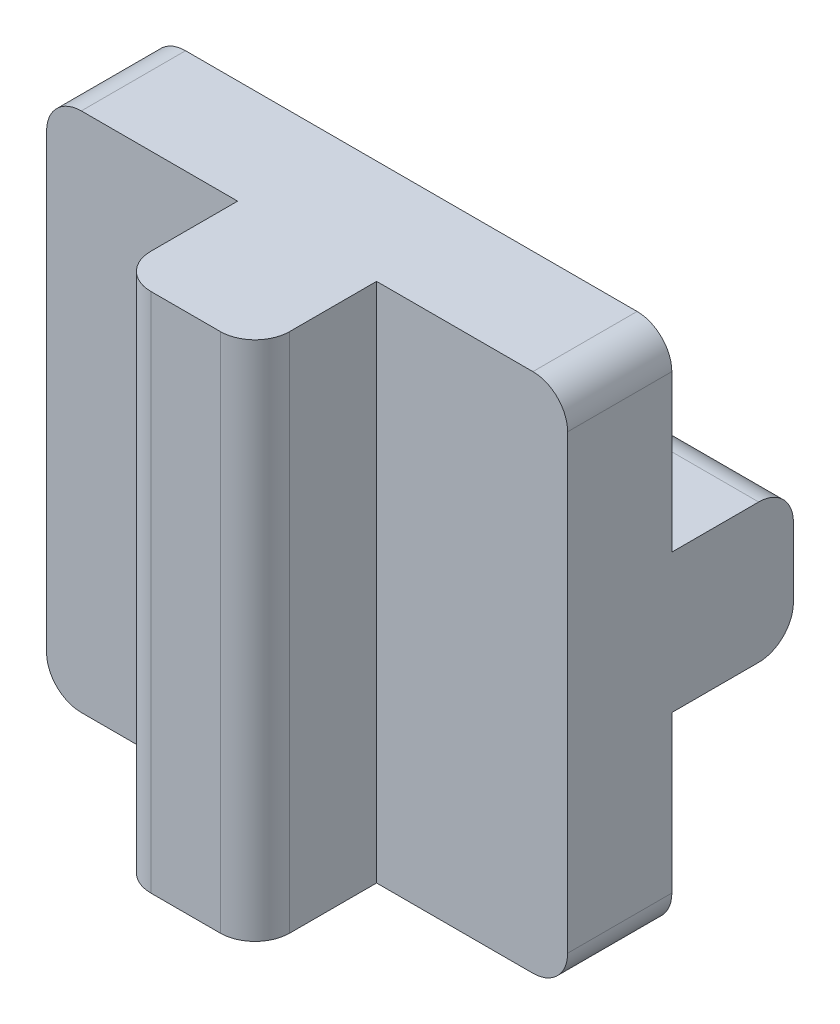
ISO-10303-21;
HEADER;
FILE_DESCRIPTION(('STEP AP214'),'2;1');
FILE_NAME('part.step','',(''),(''),'','','');
FILE_SCHEMA(('AUTOMOTIVE_DESIGN { 1 0 10303 214 1 1 1 1 }'));
ENDSEC;
DATA;
#1=APPLICATION_CONTEXT('core data for automotive mechanical design processes');
#2=APPLICATION_PROTOCOL_DEFINITION('international standard','automotive_design',2000,#1);
#3=PRODUCT_CONTEXT('',#1,'mechanical');
#4=PRODUCT('Part','Part','',(#3));
#5=PRODUCT_RELATED_PRODUCT_CATEGORY('part','',(#4));
#6=PRODUCT_DEFINITION_FORMATION('','',#4);
#7=PRODUCT_DEFINITION_CONTEXT('part definition',#1,'design');
#8=PRODUCT_DEFINITION('design','',#6,#7);
#9=PRODUCT_DEFINITION_SHAPE('','',#8);
#10=(LENGTH_UNIT() NAMED_UNIT(*) SI_UNIT(.MILLI.,.METRE.));
#11=(NAMED_UNIT(*) PLANE_ANGLE_UNIT() SI_UNIT($,.RADIAN.));
#12=(NAMED_UNIT(*) SI_UNIT($,.STERADIAN.) SOLID_ANGLE_UNIT());
#13=UNCERTAINTY_MEASURE_WITH_UNIT(LENGTH_MEASURE(1.E-05),#10,'distance_accuracy_value','');
#14=(GEOMETRIC_REPRESENTATION_CONTEXT(3) GLOBAL_UNCERTAINTY_ASSIGNED_CONTEXT((#13)) GLOBAL_UNIT_ASSIGNED_CONTEXT((#10,
#11,#12)) REPRESENTATION_CONTEXT('',''));
#15=CARTESIAN_POINT('',(0.,0.,0.));
#16=DIRECTION('',(0.,0.,1.));
#17=DIRECTION('',(1.,0.,0.));
#18=AXIS2_PLACEMENT_3D('',#15,#16,#17);
#19=CARTESIAN_POINT('',(0.,0.,6.));
#20=DIRECTION('',(0.,0.,-1.));
#21=DIRECTION('',(-1.,0.,0.));
#22=AXIS2_PLACEMENT_3D('',#19,#20,#21);
#23=PLANE('',#22);
#24=DIRECTION('',(0.,1.,0.));
#25=VECTOR('',#24,1.);
#26=CARTESIAN_POINT('',(4.,15.,6.));
#27=LINE('',#26,#25);
#28=CARTESIAN_POINT('',(4.,-15.,6.));
#29=VERTEX_POINT('',#28);
#30=CARTESIAN_POINT('',(4.,15.,6.));
#31=VERTEX_POINT('',#30);
#32=EDGE_CURVE('E194',#29,#31,#27,.T.);
#33=ORIENTED_EDGE('',*,*,#32,.F.);
#34=DIRECTION('',(1.,0.,0.));
#35=VECTOR('',#34,1.);
#36=CARTESIAN_POINT('',(-15.,-15.,6.));
#37=LINE('',#36,#35);
#38=CARTESIAN_POINT('',(13.,-15.,6.));
#39=VERTEX_POINT('',#38);
#40=EDGE_CURVE('E190',#29,#39,#37,.T.);
#41=ORIENTED_EDGE('',*,*,#40,.T.);
#42=CARTESIAN_POINT('',(13.,-13.,6.));
#43=DIRECTION('',(0.,0.,-1.));
#44=DIRECTION('',(-1.,0.,0.));
#45=AXIS2_PLACEMENT_3D('',#42,#43,#44);
#46=CIRCLE('',#45,2.);
#47=CARTESIAN_POINT('',(15.,-13.,6.));
#48=VERTEX_POINT('',#47);
#49=EDGE_CURVE('E282',#39,#48,#46,.F.);
#50=ORIENTED_EDGE('',*,*,#49,.T.);
#51=DIRECTION('',(0.,1.,0.));
#52=VECTOR('',#51,1.);
#53=CARTESIAN_POINT('',(15.,-15.,6.));
#54=LINE('',#53,#52);
#55=CARTESIAN_POINT('',(15.,13.,6.));
#56=VERTEX_POINT('',#55);
#57=EDGE_CURVE('E230',#48,#56,#54,.T.);
#58=ORIENTED_EDGE('',*,*,#57,.T.);
#59=CARTESIAN_POINT('',(13.,13.,6.));
#60=DIRECTION('',(0.,0.,-1.));
#61=DIRECTION('',(-1.,0.,0.));
#62=AXIS2_PLACEMENT_3D('',#59,#60,#61);
#63=CIRCLE('',#62,2.);
#64=CARTESIAN_POINT('',(13.,15.,6.));
#65=VERTEX_POINT('',#64);
#66=EDGE_CURVE('E287',#56,#65,#63,.F.);
#67=ORIENTED_EDGE('',*,*,#66,.T.);
#68=DIRECTION('',(-1.,0.,0.));
#69=VECTOR('',#68,1.);
#70=CARTESIAN_POINT('',(-15.,15.,6.));
#71=LINE('',#70,#69);
#72=EDGE_CURVE('E235',#65,#31,#71,.T.);
#73=ORIENTED_EDGE('',*,*,#72,.T.);
#74=EDGE_LOOP('',(#33,#41,#50,#58,#67,#73));
#75=FACE_BOUND('',#74,.T.);
#76=ADVANCED_FACE('F33',(#75),#23,.F.);
#77=DIRECTION('',(0.,-1.,0.));
#78=VECTOR('',#77,1.);
#79=CARTESIAN_POINT('',(-4.,15.,6.));
#80=LINE('',#79,#78);
#81=CARTESIAN_POINT('',(-4.,15.,6.));
#82=VERTEX_POINT('',#81);
#83=CARTESIAN_POINT('',(-4.,-15.,6.));
#84=VERTEX_POINT('',#83);
#85=EDGE_CURVE('E184',#82,#84,#80,.T.);
#86=ORIENTED_EDGE('',*,*,#85,.F.);
#87=CARTESIAN_POINT('',(-13.,15.,6.));
#88=VERTEX_POINT('',#87);
#89=EDGE_CURVE('E233',#82,#88,#71,.T.);
#90=ORIENTED_EDGE('',*,*,#89,.T.);
#91=CARTESIAN_POINT('',(-13.,13.,6.));
#92=DIRECTION('',(0.,0.,-1.));
#93=DIRECTION('',(-1.,0.,0.));
#94=AXIS2_PLACEMENT_3D('',#91,#92,#93);
#95=CIRCLE('',#94,2.);
#96=CARTESIAN_POINT('',(-15.,13.,6.));
#97=VERTEX_POINT('',#96);
#98=EDGE_CURVE('E285',#88,#97,#95,.F.);
#99=ORIENTED_EDGE('',*,*,#98,.T.);
#100=DIRECTION('',(0.,-1.,0.));
#101=VECTOR('',#100,1.);
#102=CARTESIAN_POINT('',(-15.,-15.,6.));
#103=LINE('',#102,#101);
#104=CARTESIAN_POINT('',(-15.,-13.,6.));
#105=VERTEX_POINT('',#104);
#106=EDGE_CURVE('E238',#97,#105,#103,.T.);
#107=ORIENTED_EDGE('',*,*,#106,.T.);
#108=CARTESIAN_POINT('',(-13.,-13.,6.));
#109=DIRECTION('',(0.,0.,-1.));
#110=DIRECTION('',(-1.,0.,0.));
#111=AXIS2_PLACEMENT_3D('',#108,#109,#110);
#112=CIRCLE('',#111,2.);
#113=CARTESIAN_POINT('',(-13.,-15.,6.));
#114=VERTEX_POINT('',#113);
#115=EDGE_CURVE('E188',#105,#114,#112,.F.);
#116=ORIENTED_EDGE('',*,*,#115,.T.);
#117=EDGE_CURVE('E174',#114,#84,#37,.T.);
#118=ORIENTED_EDGE('',*,*,#117,.T.);
#119=EDGE_LOOP('',(#86,#90,#99,#107,#116,#118));
#120=FACE_BOUND('',#119,.T.);
#121=ADVANCED_FACE('F183',(#120),#23,.F.);
#122=CARTESIAN_POINT('',(0.,0.,0.));
#123=DIRECTION('',(0.,0.,-1.));
#124=DIRECTION('',(-1.,0.,0.));
#125=AXIS2_PLACEMENT_3D('',#122,#123,#124);
#126=PLANE('',#125);
#127=DIRECTION('',(-1.,0.,0.));
#128=VECTOR('',#127,1.);
#129=CARTESIAN_POINT('',(-15.,15.,0.));
#130=LINE('',#129,#128);
#131=CARTESIAN_POINT('',(13.,15.,0.));
#132=VERTEX_POINT('',#131);
#133=CARTESIAN_POINT('',(-13.,15.,0.));
#134=VERTEX_POINT('',#133);
#135=EDGE_CURVE('E242',#132,#134,#130,.T.);
#136=ORIENTED_EDGE('',*,*,#135,.F.);
#137=CARTESIAN_POINT('',(13.,13.,0.));
#138=DIRECTION('',(0.,0.,-1.));
#139=DIRECTION('',(-1.,0.,0.));
#140=AXIS2_PLACEMENT_3D('',#137,#138,#139);
#141=CIRCLE('',#140,2.);
#142=CARTESIAN_POINT('',(15.,13.,0.));
#143=VERTEX_POINT('',#142);
#144=EDGE_CURVE('E275',#132,#143,#141,.T.);
#145=ORIENTED_EDGE('',*,*,#144,.T.);
#146=DIRECTION('',(0.,1.,0.));
#147=VECTOR('',#146,1.);
#148=CARTESIAN_POINT('',(15.,-15.,0.));
#149=LINE('',#148,#147);
#150=CARTESIAN_POINT('',(15.,4.,0.));
#151=VERTEX_POINT('',#150);
#152=EDGE_CURVE('E229',#151,#143,#149,.T.);
#153=ORIENTED_EDGE('',*,*,#152,.F.);
#154=DIRECTION('',(-1.,0.,0.));
#155=VECTOR('',#154,1.);
#156=CARTESIAN_POINT('',(0.,4.,0.));
#157=LINE('',#156,#155);
#158=CARTESIAN_POINT('',(-15.,4.,0.));
#159=VERTEX_POINT('',#158);
#160=EDGE_CURVE('E207',#151,#159,#157,.T.);
#161=ORIENTED_EDGE('',*,*,#160,.T.);
#162=DIRECTION('',(0.,-1.,0.));
#163=VECTOR('',#162,1.);
#164=CARTESIAN_POINT('',(-15.,-15.,0.));
#165=LINE('',#164,#163);
#166=CARTESIAN_POINT('',(-15.,13.,0.));
#167=VERTEX_POINT('',#166);
#168=EDGE_CURVE('E246',#167,#159,#165,.T.);
#169=ORIENTED_EDGE('',*,*,#168,.F.);
#170=CARTESIAN_POINT('',(-13.,13.,0.));
#171=DIRECTION('',(0.,0.,-1.));
#172=DIRECTION('',(-1.,0.,0.));
#173=AXIS2_PLACEMENT_3D('',#170,#171,#172);
#174=CIRCLE('',#173,2.);
#175=EDGE_CURVE('E273',#167,#134,#174,.T.);
#176=ORIENTED_EDGE('',*,*,#175,.T.);
#177=EDGE_LOOP('',(#136,#145,#153,#161,#169,#176));
#178=FACE_BOUND('',#177,.T.);
#179=ADVANCED_FACE('F336',(#178),#126,.T.);
#180=CARTESIAN_POINT('',(15.,-15.,6.));
#181=DIRECTION('',(-1.,0.,0.));
#182=DIRECTION('',(0.,0.,1.));
#183=AXIS2_PLACEMENT_3D('',#180,#181,#182);
#184=PLANE('',#183);
#185=ORIENTED_EDGE('',*,*,#152,.T.);
#186=DIRECTION('',(0.,0.,-1.));
#187=VECTOR('',#186,1.);
#188=CARTESIAN_POINT('',(15.,13.,6.));
#189=LINE('',#188,#187);
#190=EDGE_CURVE('E280',#143,#56,#189,.F.);
#191=ORIENTED_EDGE('',*,*,#190,.T.);
#192=ORIENTED_EDGE('',*,*,#57,.F.);
#193=DIRECTION('',(0.,0.,-1.));
#194=VECTOR('',#193,1.);
#195=CARTESIAN_POINT('',(15.,-13.,6.));
#196=LINE('',#195,#194);
#197=CARTESIAN_POINT('',(15.,-13.,0.));
#198=VERTEX_POINT('',#197);
#199=EDGE_CURVE('E277',#48,#198,#196,.T.);
#200=ORIENTED_EDGE('',*,*,#199,.T.);
#201=CARTESIAN_POINT('',(15.,-4.,0.));
#202=VERTEX_POINT('',#201);
#203=EDGE_CURVE('E240',#198,#202,#149,.T.);
#204=ORIENTED_EDGE('',*,*,#203,.T.);
#205=DIRECTION('',(0.,0.,1.));
#206=VECTOR('',#205,1.);
#207=CARTESIAN_POINT('',(15.,-4.,-7.));
#208=LINE('',#207,#206);
#209=CARTESIAN_POINT('',(15.,-4.,-5.));
#210=VERTEX_POINT('',#209);
#211=EDGE_CURVE('E224',#210,#202,#208,.T.);
#212=ORIENTED_EDGE('',*,*,#211,.F.);
#213=CARTESIAN_POINT('',(15.,-2.,-5.));
#214=DIRECTION('',(-1.,0.,0.));
#215=DIRECTION('',(0.,0.,1.));
#216=AXIS2_PLACEMENT_3D('',#213,#214,#215);
#217=CIRCLE('',#216,2.);
#218=CARTESIAN_POINT('',(15.,-2.,-7.));
#219=VERTEX_POINT('',#218);
#220=EDGE_CURVE('E261',#210,#219,#217,.F.);
#221=ORIENTED_EDGE('',*,*,#220,.T.);
#222=DIRECTION('',(0.,-1.,0.));
#223=VECTOR('',#222,1.);
#224=CARTESIAN_POINT('',(15.,0.,-7.));
#225=LINE('',#224,#223);
#226=CARTESIAN_POINT('',(15.,2.,-7.));
#227=VERTEX_POINT('',#226);
#228=EDGE_CURVE('E208',#227,#219,#225,.T.);
#229=ORIENTED_EDGE('',*,*,#228,.F.);
#230=CARTESIAN_POINT('',(15.,2.,-5.));
#231=DIRECTION('',(-1.,0.,0.));
#232=DIRECTION('',(0.,0.,1.));
#233=AXIS2_PLACEMENT_3D('',#230,#231,#232);
#234=CIRCLE('',#233,2.);
#235=CARTESIAN_POINT('',(15.,4.,-5.));
#236=VERTEX_POINT('',#235);
#237=EDGE_CURVE('E263',#227,#236,#234,.F.);
#238=ORIENTED_EDGE('',*,*,#237,.T.);
#239=DIRECTION('',(0.,0.,1.));
#240=VECTOR('',#239,1.);
#241=CARTESIAN_POINT('',(15.,4.,-7.));
#242=LINE('',#241,#240);
#243=EDGE_CURVE('E227',#236,#151,#242,.T.);
#244=ORIENTED_EDGE('',*,*,#243,.T.);
#245=EDGE_LOOP('',(#185,#191,#192,#200,#204,#212,#221,#229,#238,#244));
#246=FACE_BOUND('',#245,.T.);
#247=ADVANCED_FACE('F354',(#246),#184,.F.);
#248=CARTESIAN_POINT('',(-15.,15.,6.));
#249=DIRECTION('',(0.,-1.,0.));
#250=DIRECTION('',(0.,0.,-1.));
#251=AXIS2_PLACEMENT_3D('',#248,#249,#250);
#252=PLANE('',#251);
#253=DIRECTION('',(0.,0.,-1.));
#254=VECTOR('',#253,1.);
#255=CARTESIAN_POINT('',(-4.,15.,13.));
#256=LINE('',#255,#254);
#257=CARTESIAN_POINT('',(-4.,15.,11.));
#258=VERTEX_POINT('',#257);
#259=EDGE_CURVE('E178',#258,#82,#256,.T.);
#260=ORIENTED_EDGE('',*,*,#259,.F.);
#261=CARTESIAN_POINT('',(-2.,15.,11.));
#262=DIRECTION('',(0.,-1.,0.));
#263=DIRECTION('',(0.,0.,-1.));
#264=AXIS2_PLACEMENT_3D('',#261,#262,#263);
#265=CIRCLE('',#264,2.);
#266=CARTESIAN_POINT('',(-2.,15.,13.));
#267=VERTEX_POINT('',#266);
#268=EDGE_CURVE('E41',#258,#267,#265,.F.);
#269=ORIENTED_EDGE('',*,*,#268,.T.);
#270=DIRECTION('',(-1.,0.,0.));
#271=VECTOR('',#270,1.);
#272=CARTESIAN_POINT('',(-4.,15.,13.));
#273=LINE('',#272,#271);
#274=CARTESIAN_POINT('',(2.,15.,13.));
#275=VERTEX_POINT('',#274);
#276=EDGE_CURVE('E193',#275,#267,#273,.T.);
#277=ORIENTED_EDGE('',*,*,#276,.F.);
#278=CARTESIAN_POINT('',(2.,15.,11.));
#279=DIRECTION('',(0.,-1.,0.));
#280=DIRECTION('',(0.,0.,-1.));
#281=AXIS2_PLACEMENT_3D('',#278,#279,#280);
#282=CIRCLE('',#281,2.);
#283=CARTESIAN_POINT('',(4.,15.,11.));
#284=VERTEX_POINT('',#283);
#285=EDGE_CURVE('E48',#275,#284,#282,.F.);
#286=ORIENTED_EDGE('',*,*,#285,.T.);
#287=DIRECTION('',(0.,0.,-1.));
#288=VECTOR('',#287,1.);
#289=CARTESIAN_POINT('',(4.,15.,13.));
#290=LINE('',#289,#288);
#291=EDGE_CURVE('E205',#284,#31,#290,.T.);
#292=ORIENTED_EDGE('',*,*,#291,.T.);
#293=ORIENTED_EDGE('',*,*,#72,.F.);
#294=DIRECTION('',(0.,0.,-1.));
#295=VECTOR('',#294,1.);
#296=CARTESIAN_POINT('',(13.,15.,6.));
#297=LINE('',#296,#295);
#298=EDGE_CURVE('E270',#65,#132,#297,.T.);
#299=ORIENTED_EDGE('',*,*,#298,.T.);
#300=ORIENTED_EDGE('',*,*,#135,.T.);
#301=DIRECTION('',(0.,0.,-1.));
#302=VECTOR('',#301,1.);
#303=CARTESIAN_POINT('',(-13.,15.,6.));
#304=LINE('',#303,#302);
#305=EDGE_CURVE('E267',#134,#88,#304,.F.);
#306=ORIENTED_EDGE('',*,*,#305,.T.);
#307=ORIENTED_EDGE('',*,*,#89,.F.);
#308=EDGE_LOOP('',(#260,#269,#277,#286,#292,#293,#299,#300,#306,#307));
#309=FACE_BOUND('',#308,.T.);
#310=ADVANCED_FACE('F314',(#309),#252,.F.);
#311=CARTESIAN_POINT('',(-15.,-15.,6.));
#312=DIRECTION('',(1.,0.,0.));
#313=DIRECTION('',(0.,0.,-1.));
#314=AXIS2_PLACEMENT_3D('',#311,#312,#313);
#315=PLANE('',#314);
#316=ORIENTED_EDGE('',*,*,#106,.F.);
#317=DIRECTION('',(0.,0.,-1.));
#318=VECTOR('',#317,1.);
#319=CARTESIAN_POINT('',(-15.,13.,6.));
#320=LINE('',#319,#318);
#321=EDGE_CURVE('E291',#97,#167,#320,.T.);
#322=ORIENTED_EDGE('',*,*,#321,.T.);
#323=ORIENTED_EDGE('',*,*,#168,.T.);
#324=DIRECTION('',(0.,0.,1.));
#325=VECTOR('',#324,1.);
#326=CARTESIAN_POINT('',(-15.,4.,-7.));
#327=LINE('',#326,#325);
#328=CARTESIAN_POINT('',(-15.,4.,-5.));
#329=VERTEX_POINT('',#328);
#330=EDGE_CURVE('E215',#329,#159,#327,.T.);
#331=ORIENTED_EDGE('',*,*,#330,.F.);
#332=CARTESIAN_POINT('',(-15.,2.,-5.));
#333=DIRECTION('',(1.,0.,0.));
#334=DIRECTION('',(0.,0.,-1.));
#335=AXIS2_PLACEMENT_3D('',#332,#333,#334);
#336=CIRCLE('',#335,2.);
#337=CARTESIAN_POINT('',(-15.,2.,-7.));
#338=VERTEX_POINT('',#337);
#339=EDGE_CURVE('E254',#329,#338,#336,.F.);
#340=ORIENTED_EDGE('',*,*,#339,.T.);
#341=DIRECTION('',(0.,1.,0.));
#342=VECTOR('',#341,1.);
#343=CARTESIAN_POINT('',(-15.,0.,-7.));
#344=LINE('',#343,#342);
#345=CARTESIAN_POINT('',(-15.,-2.,-7.));
#346=VERTEX_POINT('',#345);
#347=EDGE_CURVE('E211',#346,#338,#344,.T.);
#348=ORIENTED_EDGE('',*,*,#347,.F.);
#349=CARTESIAN_POINT('',(-15.,-2.,-5.));
#350=DIRECTION('',(1.,0.,0.));
#351=DIRECTION('',(0.,0.,-1.));
#352=AXIS2_PLACEMENT_3D('',#349,#350,#351);
#353=CIRCLE('',#352,2.);
#354=CARTESIAN_POINT('',(-15.,-4.,-5.));
#355=VERTEX_POINT('',#354);
#356=EDGE_CURVE('E252',#346,#355,#353,.F.);
#357=ORIENTED_EDGE('',*,*,#356,.T.);
#358=DIRECTION('',(0.,0.,1.));
#359=VECTOR('',#358,1.);
#360=CARTESIAN_POINT('',(-15.,-4.,-7.));
#361=LINE('',#360,#359);
#362=CARTESIAN_POINT('',(-15.,-4.,0.));
#363=VERTEX_POINT('',#362);
#364=EDGE_CURVE('E222',#355,#363,#361,.T.);
#365=ORIENTED_EDGE('',*,*,#364,.T.);
#366=CARTESIAN_POINT('',(-15.,-13.,0.));
#367=VERTEX_POINT('',#366);
#368=EDGE_CURVE('E245',#363,#367,#165,.T.);
#369=ORIENTED_EDGE('',*,*,#368,.T.);
#370=DIRECTION('',(0.,0.,-1.));
#371=VECTOR('',#370,1.);
#372=CARTESIAN_POINT('',(-15.,-13.,6.));
#373=LINE('',#372,#371);
#374=EDGE_CURVE('E289',#367,#105,#373,.F.);
#375=ORIENTED_EDGE('',*,*,#374,.T.);
#376=EDGE_LOOP('',(#316,#322,#323,#331,#340,#348,#357,#365,#369,#375));
#377=FACE_BOUND('',#376,.T.);
#378=ADVANCED_FACE('F348',(#377),#315,.F.);
#379=CARTESIAN_POINT('',(-15.,-15.,6.));
#380=DIRECTION('',(0.,1.,0.));
#381=DIRECTION('',(0.,0.,1.));
#382=AXIS2_PLACEMENT_3D('',#379,#380,#381);
#383=PLANE('',#382);
#384=DIRECTION('',(1.,0.,0.));
#385=VECTOR('',#384,1.);
#386=CARTESIAN_POINT('',(-4.,-15.,13.));
#387=LINE('',#386,#385);
#388=CARTESIAN_POINT('',(-2.,-15.,13.));
#389=VERTEX_POINT('',#388);
#390=CARTESIAN_POINT('',(2.,-15.,13.));
#391=VERTEX_POINT('',#390);
#392=EDGE_CURVE('E197',#389,#391,#387,.T.);
#393=ORIENTED_EDGE('',*,*,#392,.F.);
#394=CARTESIAN_POINT('',(-2.,-15.,11.));
#395=DIRECTION('',(0.,1.,0.));
#396=DIRECTION('',(0.,0.,1.));
#397=AXIS2_PLACEMENT_3D('',#394,#395,#396);
#398=CIRCLE('',#397,2.);
#399=CARTESIAN_POINT('',(-4.,-15.,11.));
#400=VERTEX_POINT('',#399);
#401=EDGE_CURVE('E176',#389,#400,#398,.F.);
#402=ORIENTED_EDGE('',*,*,#401,.T.);
#403=DIRECTION('',(0.,0.,-1.));
#404=VECTOR('',#403,1.);
#405=CARTESIAN_POINT('',(-4.,-15.,13.));
#406=LINE('',#405,#404);
#407=EDGE_CURVE('E169',#400,#84,#406,.T.);
#408=ORIENTED_EDGE('',*,*,#407,.T.);
#409=ORIENTED_EDGE('',*,*,#117,.F.);
#410=DIRECTION('',(0.,0.,-1.));
#411=VECTOR('',#410,1.);
#412=CARTESIAN_POINT('',(-13.,-15.,6.));
#413=LINE('',#412,#411);
#414=CARTESIAN_POINT('',(-13.,-15.,0.));
#415=VERTEX_POINT('',#414);
#416=EDGE_CURVE('E297',#114,#415,#413,.T.);
#417=ORIENTED_EDGE('',*,*,#416,.T.);
#418=DIRECTION('',(1.,0.,0.));
#419=VECTOR('',#418,1.);
#420=CARTESIAN_POINT('',(-15.,-15.,0.));
#421=LINE('',#420,#419);
#422=CARTESIAN_POINT('',(13.,-15.,0.));
#423=VERTEX_POINT('',#422);
#424=EDGE_CURVE('E234',#415,#423,#421,.T.);
#425=ORIENTED_EDGE('',*,*,#424,.T.);
#426=DIRECTION('',(0.,0.,-1.));
#427=VECTOR('',#426,1.);
#428=CARTESIAN_POINT('',(13.,-15.,6.));
#429=LINE('',#428,#427);
#430=EDGE_CURVE('E294',#423,#39,#429,.F.);
#431=ORIENTED_EDGE('',*,*,#430,.T.);
#432=ORIENTED_EDGE('',*,*,#40,.F.);
#433=DIRECTION('',(0.,0.,-1.));
#434=VECTOR('',#433,1.);
#435=CARTESIAN_POINT('',(4.,-15.,13.));
#436=LINE('',#435,#434);
#437=CARTESIAN_POINT('',(4.,-15.,11.));
#438=VERTEX_POINT('',#437);
#439=EDGE_CURVE('E179',#438,#29,#436,.T.);
#440=ORIENTED_EDGE('',*,*,#439,.F.);
#441=CARTESIAN_POINT('',(2.,-15.,11.));
#442=DIRECTION('',(0.,1.,0.));
#443=DIRECTION('',(0.,0.,1.));
#444=AXIS2_PLACEMENT_3D('',#441,#442,#443);
#445=CIRCLE('',#444,2.);
#446=EDGE_CURVE('E309',#438,#391,#445,.F.);
#447=ORIENTED_EDGE('',*,*,#446,.T.);
#448=EDGE_LOOP('',(#393,#402,#408,#409,#417,#425,#431,#432,#440,#447));
#449=FACE_BOUND('',#448,.T.);
#450=ADVANCED_FACE('F172',(#449),#383,.F.);
#451=ORIENTED_EDGE('',*,*,#424,.F.);
#452=CARTESIAN_POINT('',(-13.,-13.,0.));
#453=DIRECTION('',(0.,0.,-1.));
#454=DIRECTION('',(-1.,0.,0.));
#455=AXIS2_PLACEMENT_3D('',#452,#453,#454);
#456=CIRCLE('',#455,2.);
#457=EDGE_CURVE('E301',#415,#367,#456,.T.);
#458=ORIENTED_EDGE('',*,*,#457,.T.);
#459=ORIENTED_EDGE('',*,*,#368,.F.);
#460=DIRECTION('',(-1.,0.,0.));
#461=VECTOR('',#460,1.);
#462=CARTESIAN_POINT('',(0.,-4.,0.));
#463=LINE('',#462,#461);
#464=EDGE_CURVE('E212',#202,#363,#463,.T.);
#465=ORIENTED_EDGE('',*,*,#464,.F.);
#466=ORIENTED_EDGE('',*,*,#203,.F.);
#467=CARTESIAN_POINT('',(13.,-13.,0.));
#468=DIRECTION('',(0.,0.,-1.));
#469=DIRECTION('',(-1.,0.,0.));
#470=AXIS2_PLACEMENT_3D('',#467,#468,#469);
#471=CIRCLE('',#470,2.);
#472=EDGE_CURVE('E299',#198,#423,#471,.T.);
#473=ORIENTED_EDGE('',*,*,#472,.T.);
#474=EDGE_LOOP('',(#451,#458,#459,#465,#466,#473));
#475=FACE_BOUND('',#474,.T.);
#476=ADVANCED_FACE('F342',(#475),#126,.T.);
#477=CARTESIAN_POINT('',(0.,4.,-7.));
#478=DIRECTION('',(0.,1.,0.));
#479=DIRECTION('',(0.,0.,1.));
#480=AXIS2_PLACEMENT_3D('',#477,#478,#479);
#481=PLANE('',#480);
#482=ORIENTED_EDGE('',*,*,#243,.F.);
#483=DIRECTION('',(-1.,0.,0.));
#484=VECTOR('',#483,1.);
#485=CARTESIAN_POINT('',(0.,4.,-5.));
#486=LINE('',#485,#484);
#487=EDGE_CURVE('E189',#236,#329,#486,.T.);
#488=ORIENTED_EDGE('',*,*,#487,.T.);
#489=ORIENTED_EDGE('',*,*,#330,.T.);
#490=ORIENTED_EDGE('',*,*,#160,.F.);
#491=EDGE_LOOP('',(#482,#488,#489,#490));
#492=FACE_BOUND('',#491,.T.);
#493=ADVANCED_FACE('F340',(#492),#481,.T.);
#494=CARTESIAN_POINT('',(0.,-4.,-7.));
#495=DIRECTION('',(0.,1.,0.));
#496=DIRECTION('',(0.,0.,1.));
#497=AXIS2_PLACEMENT_3D('',#494,#495,#496);
#498=PLANE('',#497);
#499=ORIENTED_EDGE('',*,*,#364,.F.);
#500=DIRECTION('',(-1.,0.,0.));
#501=VECTOR('',#500,1.);
#502=CARTESIAN_POINT('',(15.,-4.,-5.));
#503=LINE('',#502,#501);
#504=EDGE_CURVE('E265',#355,#210,#503,.F.);
#505=ORIENTED_EDGE('',*,*,#504,.T.);
#506=ORIENTED_EDGE('',*,*,#211,.T.);
#507=ORIENTED_EDGE('',*,*,#464,.T.);
#508=EDGE_LOOP('',(#499,#505,#506,#507));
#509=FACE_BOUND('',#508,.T.);
#510=ADVANCED_FACE('F411',(#509),#498,.F.);
#511=CARTESIAN_POINT('',(0.,0.,-7.));
#512=DIRECTION('',(0.,0.,-1.));
#513=DIRECTION('',(-1.,0.,0.));
#514=AXIS2_PLACEMENT_3D('',#511,#512,#513);
#515=PLANE('',#514);
#516=ORIENTED_EDGE('',*,*,#347,.T.);
#517=DIRECTION('',(-1.,0.,0.));
#518=VECTOR('',#517,1.);
#519=CARTESIAN_POINT('',(0.,2.,-7.));
#520=LINE('',#519,#518);
#521=EDGE_CURVE('E259',#338,#227,#520,.F.);
#522=ORIENTED_EDGE('',*,*,#521,.T.);
#523=ORIENTED_EDGE('',*,*,#228,.T.);
#524=DIRECTION('',(-1.,0.,0.));
#525=VECTOR('',#524,1.);
#526=CARTESIAN_POINT('',(-15.,-2.,-7.));
#527=LINE('',#526,#525);
#528=EDGE_CURVE('E256',#219,#346,#527,.T.);
#529=ORIENTED_EDGE('',*,*,#528,.T.);
#530=EDGE_LOOP('',(#516,#522,#523,#529));
#531=FACE_BOUND('',#530,.T.);
#532=ADVANCED_FACE('F362',(#531),#515,.T.);
#533=CARTESIAN_POINT('',(0.,2.,-5.));
#534=DIRECTION('',(-1.,0.,0.));
#535=DIRECTION('',(0.,0.,1.));
#536=AXIS2_PLACEMENT_3D('',#533,#534,#535);
#537=CYLINDRICAL_SURFACE('',#536,2.);
#538=ORIENTED_EDGE('',*,*,#237,.F.);
#539=ORIENTED_EDGE('',*,*,#521,.F.);
#540=ORIENTED_EDGE('',*,*,#339,.F.);
#541=ORIENTED_EDGE('',*,*,#487,.F.);
#542=EDGE_LOOP('',(#538,#539,#540,#541));
#543=FACE_BOUND('',#542,.T.);
#544=ADVANCED_FACE('F358',(#543),#537,.T.);
#545=CARTESIAN_POINT('',(0.,-2.,-5.));
#546=DIRECTION('',(1.,0.,0.));
#547=DIRECTION('',(0.,0.,-1.));
#548=AXIS2_PLACEMENT_3D('',#545,#546,#547);
#549=CYLINDRICAL_SURFACE('',#548,2.);
#550=ORIENTED_EDGE('',*,*,#220,.F.);
#551=ORIENTED_EDGE('',*,*,#504,.F.);
#552=ORIENTED_EDGE('',*,*,#356,.F.);
#553=ORIENTED_EDGE('',*,*,#528,.F.);
#554=EDGE_LOOP('',(#550,#551,#552,#553));
#555=FACE_BOUND('',#554,.T.);
#556=ADVANCED_FACE('F361',(#555),#549,.T.);
#557=CARTESIAN_POINT('',(13.,13.,6.));
#558=DIRECTION('',(0.,0.,-1.));
#559=DIRECTION('',(-1.,0.,0.));
#560=AXIS2_PLACEMENT_3D('',#557,#558,#559);
#561=CYLINDRICAL_SURFACE('',#560,2.);
#562=ORIENTED_EDGE('',*,*,#66,.F.);
#563=ORIENTED_EDGE('',*,*,#190,.F.);
#564=ORIENTED_EDGE('',*,*,#144,.F.);
#565=ORIENTED_EDGE('',*,*,#298,.F.);
#566=EDGE_LOOP('',(#562,#563,#564,#565));
#567=FACE_BOUND('',#566,.T.);
#568=ADVANCED_FACE('F366',(#567),#561,.T.);
#569=CARTESIAN_POINT('',(-13.,13.,6.));
#570=DIRECTION('',(0.,0.,-1.));
#571=DIRECTION('',(-1.,0.,0.));
#572=AXIS2_PLACEMENT_3D('',#569,#570,#571);
#573=CYLINDRICAL_SURFACE('',#572,2.);
#574=ORIENTED_EDGE('',*,*,#98,.F.);
#575=ORIENTED_EDGE('',*,*,#305,.F.);
#576=ORIENTED_EDGE('',*,*,#175,.F.);
#577=ORIENTED_EDGE('',*,*,#321,.F.);
#578=EDGE_LOOP('',(#574,#575,#576,#577));
#579=FACE_BOUND('',#578,.T.);
#580=ADVANCED_FACE('F370',(#579),#573,.T.);
#581=CARTESIAN_POINT('',(-13.,-13.,6.));
#582=DIRECTION('',(0.,0.,-1.));
#583=DIRECTION('',(-1.,0.,0.));
#584=AXIS2_PLACEMENT_3D('',#581,#582,#583);
#585=CYLINDRICAL_SURFACE('',#584,2.);
#586=ORIENTED_EDGE('',*,*,#115,.F.);
#587=ORIENTED_EDGE('',*,*,#374,.F.);
#588=ORIENTED_EDGE('',*,*,#457,.F.);
#589=ORIENTED_EDGE('',*,*,#416,.F.);
#590=EDGE_LOOP('',(#586,#587,#588,#589));
#591=FACE_BOUND('',#590,.T.);
#592=ADVANCED_FACE('F374',(#591),#585,.T.);
#593=CARTESIAN_POINT('',(13.,-13.,6.));
#594=DIRECTION('',(0.,0.,-1.));
#595=DIRECTION('',(-1.,0.,0.));
#596=AXIS2_PLACEMENT_3D('',#593,#594,#595);
#597=CYLINDRICAL_SURFACE('',#596,2.);
#598=ORIENTED_EDGE('',*,*,#49,.F.);
#599=ORIENTED_EDGE('',*,*,#430,.F.);
#600=ORIENTED_EDGE('',*,*,#472,.F.);
#601=ORIENTED_EDGE('',*,*,#199,.F.);
#602=EDGE_LOOP('',(#598,#599,#600,#601));
#603=FACE_BOUND('',#602,.T.);
#604=ADVANCED_FACE('F377',(#603),#597,.T.);
#605=CARTESIAN_POINT('',(4.,15.,13.));
#606=DIRECTION('',(-1.,0.,0.));
#607=DIRECTION('',(0.,0.,1.));
#608=AXIS2_PLACEMENT_3D('',#605,#606,#607);
#609=PLANE('',#608);
#610=ORIENTED_EDGE('',*,*,#291,.F.);
#611=DIRECTION('',(0.,1.,0.));
#612=VECTOR('',#611,1.);
#613=CARTESIAN_POINT('',(4.,-15.,11.));
#614=LINE('',#613,#612);
#615=EDGE_CURVE('E11',#284,#438,#614,.F.);
#616=ORIENTED_EDGE('',*,*,#615,.T.);
#617=ORIENTED_EDGE('',*,*,#439,.T.);
#618=ORIENTED_EDGE('',*,*,#32,.T.);
#619=EDGE_LOOP('',(#610,#616,#617,#618));
#620=FACE_BOUND('',#619,.T.);
#621=ADVANCED_FACE('F380',(#620),#609,.F.);
#622=CARTESIAN_POINT('',(-4.,15.,13.));
#623=DIRECTION('',(1.,0.,0.));
#624=DIRECTION('',(0.,0.,-1.));
#625=AXIS2_PLACEMENT_3D('',#622,#623,#624);
#626=PLANE('',#625);
#627=ORIENTED_EDGE('',*,*,#407,.F.);
#628=DIRECTION('',(0.,-1.,0.));
#629=VECTOR('',#628,1.);
#630=CARTESIAN_POINT('',(-4.,15.,11.));
#631=LINE('',#630,#629);
#632=EDGE_CURVE('E56',#400,#258,#631,.F.);
#633=ORIENTED_EDGE('',*,*,#632,.T.);
#634=ORIENTED_EDGE('',*,*,#259,.T.);
#635=ORIENTED_EDGE('',*,*,#85,.T.);
#636=EDGE_LOOP('',(#627,#633,#634,#635));
#637=FACE_BOUND('',#636,.T.);
#638=ADVANCED_FACE('F192',(#637),#626,.F.);
#639=CARTESIAN_POINT('',(0.,0.,13.));
#640=DIRECTION('',(0.,0.,1.));
#641=DIRECTION('',(1.,0.,0.));
#642=AXIS2_PLACEMENT_3D('',#639,#640,#641);
#643=PLANE('',#642);
#644=ORIENTED_EDGE('',*,*,#276,.T.);
#645=DIRECTION('',(0.,-1.,0.));
#646=VECTOR('',#645,1.);
#647=CARTESIAN_POINT('',(-2.,-15.,13.));
#648=LINE('',#647,#646);
#649=EDGE_CURVE('E306',#267,#389,#648,.T.);
#650=ORIENTED_EDGE('',*,*,#649,.T.);
#651=ORIENTED_EDGE('',*,*,#392,.T.);
#652=DIRECTION('',(0.,1.,0.));
#653=VECTOR('',#652,1.);
#654=CARTESIAN_POINT('',(2.,15.,13.));
#655=LINE('',#654,#653);
#656=EDGE_CURVE('E303',#391,#275,#655,.T.);
#657=ORIENTED_EDGE('',*,*,#656,.T.);
#658=EDGE_LOOP('',(#644,#650,#651,#657));
#659=FACE_BOUND('',#658,.T.);
#660=ADVANCED_FACE('F318',(#659),#643,.T.);
#661=CARTESIAN_POINT('',(-2.,0.,11.));
#662=DIRECTION('',(0.,1.,0.));
#663=DIRECTION('',(0.,0.,1.));
#664=AXIS2_PLACEMENT_3D('',#661,#662,#663);
#665=CYLINDRICAL_SURFACE('',#664,2.);
#666=ORIENTED_EDGE('',*,*,#268,.F.);
#667=ORIENTED_EDGE('',*,*,#632,.F.);
#668=ORIENTED_EDGE('',*,*,#401,.F.);
#669=ORIENTED_EDGE('',*,*,#649,.F.);
#670=EDGE_LOOP('',(#666,#667,#668,#669));
#671=FACE_BOUND('',#670,.T.);
#672=ADVANCED_FACE('F321',(#671),#665,.T.);
#673=CARTESIAN_POINT('',(2.,0.,11.));
#674=DIRECTION('',(0.,-1.,0.));
#675=DIRECTION('',(0.,0.,-1.));
#676=AXIS2_PLACEMENT_3D('',#673,#674,#675);
#677=CYLINDRICAL_SURFACE('',#676,2.);
#678=ORIENTED_EDGE('',*,*,#446,.F.);
#679=ORIENTED_EDGE('',*,*,#615,.F.);
#680=ORIENTED_EDGE('',*,*,#285,.F.);
#681=ORIENTED_EDGE('',*,*,#656,.F.);
#682=EDGE_LOOP('',(#678,#679,#680,#681));
#683=FACE_BOUND('',#682,.T.);
#684=ADVANCED_FACE('F35',(#683),#677,.T.);
#685=CLOSED_SHELL('',(#76,#121,#179,#247,#310,#378,#450,#476,#493,#510,#532,#544,#556,#568,#580,
#592,#604,#621,#638,#660,#672,#684));
#686=MANIFOLD_SOLID_BREP('B2',#685);
#687=ADVANCED_BREP_SHAPE_REPRESENTATION('',(#18,#686),#14);
#688=SHAPE_DEFINITION_REPRESENTATION(#9,#687);
ENDSEC;
END-ISO-10303-21;
